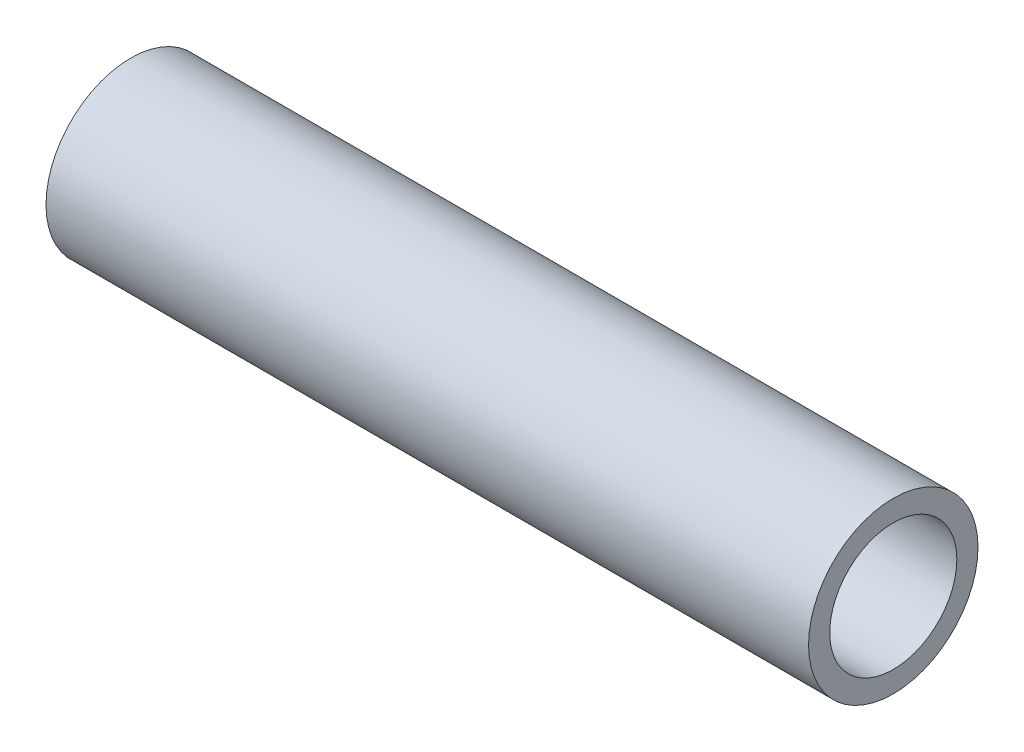
ISO-10303-21;
HEADER;
FILE_DESCRIPTION(('STEP AP214'),'2;1');
FILE_NAME('part.step','',(''),(''),'','','');
FILE_SCHEMA(('AUTOMOTIVE_DESIGN { 1 0 10303 214 1 1 1 1 }'));
ENDSEC;
DATA;
#1=APPLICATION_CONTEXT('core data for automotive mechanical design processes');
#2=APPLICATION_PROTOCOL_DEFINITION('international standard','automotive_design',2000,#1);
#3=PRODUCT_CONTEXT('',#1,'mechanical');
#4=PRODUCT('Part','Part','',(#3));
#5=PRODUCT_RELATED_PRODUCT_CATEGORY('part','',(#4));
#6=PRODUCT_DEFINITION_FORMATION('','',#4);
#7=PRODUCT_DEFINITION_CONTEXT('part definition',#1,'design');
#8=PRODUCT_DEFINITION('design','',#6,#7);
#9=PRODUCT_DEFINITION_SHAPE('','',#8);
#10=(LENGTH_UNIT() NAMED_UNIT(*) SI_UNIT(.MILLI.,.METRE.));
#11=(NAMED_UNIT(*) PLANE_ANGLE_UNIT() SI_UNIT($,.RADIAN.));
#12=(NAMED_UNIT(*) SI_UNIT($,.STERADIAN.) SOLID_ANGLE_UNIT());
#13=UNCERTAINTY_MEASURE_WITH_UNIT(LENGTH_MEASURE(1.E-05),#10,'distance_accuracy_value','');
#14=(GEOMETRIC_REPRESENTATION_CONTEXT(3) GLOBAL_UNCERTAINTY_ASSIGNED_CONTEXT((#13)) GLOBAL_UNIT_ASSIGNED_CONTEXT((#10,
#11,#12)) REPRESENTATION_CONTEXT('',''));
#15=CARTESIAN_POINT('',(0.,0.,0.));
#16=DIRECTION('',(0.,0.,1.));
#17=DIRECTION('',(1.,0.,0.));
#18=AXIS2_PLACEMENT_3D('',#15,#16,#17);
#19=CARTESIAN_POINT('',(114.3,0.,0.));
#20=DIRECTION('',(1.,0.,0.));
#21=DIRECTION('',(0.,0.,-1.));
#22=AXIS2_PLACEMENT_3D('',#19,#20,#21);
#23=PLANE('',#22);
#24=CARTESIAN_POINT('',(114.3,0.,0.));
#25=DIRECTION('',(1.,0.,0.));
#26=DIRECTION('',(0.,0.,-1.));
#27=AXIS2_PLACEMENT_3D('',#24,#25,#26);
#28=CIRCLE('',#27,12.7);
#29=CARTESIAN_POINT('',(114.3,0.,-12.7));
#30=VERTEX_POINT('',#29);
#31=EDGE_CURVE('E10',#30,#30,#28,.T.);
#32=ORIENTED_EDGE('',*,*,#31,.T.);
#33=EDGE_LOOP('',(#32));
#34=FACE_BOUND('',#33,.T.);
#35=CARTESIAN_POINT('',(114.3,0.,0.));
#36=DIRECTION('',(1.,0.,0.));
#37=DIRECTION('',(0.,0.,-1.));
#38=AXIS2_PLACEMENT_3D('',#35,#36,#37);
#39=CIRCLE('',#38,9.525);
#40=CARTESIAN_POINT('',(114.3,0.,-9.525));
#41=VERTEX_POINT('',#40);
#42=EDGE_CURVE('E44',#41,#41,#39,.T.);
#43=ORIENTED_EDGE('',*,*,#42,.F.);
#44=EDGE_LOOP('',(#43));
#45=FACE_BOUND('',#44,.T.);
#46=ADVANCED_FACE('F33',(#34,#45),#23,.T.);
#47=CARTESIAN_POINT('',(0.,0.,0.));
#48=DIRECTION('',(1.,0.,0.));
#49=DIRECTION('',(0.,0.,-1.));
#50=AXIS2_PLACEMENT_3D('',#47,#48,#49);
#51=PLANE('',#50);
#52=CARTESIAN_POINT('',(0.,0.,0.));
#53=DIRECTION('',(1.,0.,0.));
#54=DIRECTION('',(0.,0.,-1.));
#55=AXIS2_PLACEMENT_3D('',#52,#53,#54);
#56=CIRCLE('',#55,12.7);
#57=CARTESIAN_POINT('',(0.,0.,-12.7));
#58=VERTEX_POINT('',#57);
#59=EDGE_CURVE('E37',#58,#58,#56,.T.);
#60=ORIENTED_EDGE('',*,*,#59,.F.);
#61=EDGE_LOOP('',(#60));
#62=FACE_BOUND('',#61,.T.);
#63=CARTESIAN_POINT('',(0.,0.,0.));
#64=DIRECTION('',(1.,0.,0.));
#65=DIRECTION('',(0.,0.,-1.));
#66=AXIS2_PLACEMENT_3D('',#63,#64,#65);
#67=CIRCLE('',#66,9.525);
#68=CARTESIAN_POINT('',(0.,0.,-9.525));
#69=VERTEX_POINT('',#68);
#70=EDGE_CURVE('E46',#69,#69,#67,.T.);
#71=ORIENTED_EDGE('',*,*,#70,.T.);
#72=EDGE_LOOP('',(#71));
#73=FACE_BOUND('',#72,.T.);
#74=ADVANCED_FACE('F56',(#62,#73),#51,.F.);
#75=CARTESIAN_POINT('',(114.3,0.,0.));
#76=DIRECTION('',(-1.,0.,0.));
#77=DIRECTION('',(0.,0.,1.));
#78=AXIS2_PLACEMENT_3D('',#75,#76,#77);
#79=CYLINDRICAL_SURFACE('',#78,12.7);
#80=ORIENTED_EDGE('',*,*,#31,.F.);
#81=EDGE_LOOP('',(#80));
#82=FACE_BOUND('',#81,.T.);
#83=ORIENTED_EDGE('',*,*,#59,.T.);
#84=EDGE_LOOP('',(#83));
#85=FACE_BOUND('',#84,.T.);
#86=ADVANCED_FACE('F35',(#82,#85),#79,.T.);
#87=CARTESIAN_POINT('',(114.3,0.,0.));
#88=DIRECTION('',(-1.,0.,0.));
#89=DIRECTION('',(0.,0.,1.));
#90=AXIS2_PLACEMENT_3D('',#87,#88,#89);
#91=CYLINDRICAL_SURFACE('',#90,9.525);
#92=ORIENTED_EDGE('',*,*,#42,.T.);
#93=EDGE_LOOP('',(#92));
#94=FACE_BOUND('',#93,.T.);
#95=ORIENTED_EDGE('',*,*,#70,.F.);
#96=EDGE_LOOP('',(#95));
#97=FACE_BOUND('',#96,.T.);
#98=ADVANCED_FACE('F52',(#94,#97),#91,.F.);
#99=CLOSED_SHELL('',(#46,#74,#86,#98));
#100=MANIFOLD_SOLID_BREP('B2',#99);
#101=ADVANCED_BREP_SHAPE_REPRESENTATION('',(#18,#100),#14);
#102=SHAPE_DEFINITION_REPRESENTATION(#9,#101);
ENDSEC;
END-ISO-10303-21;
